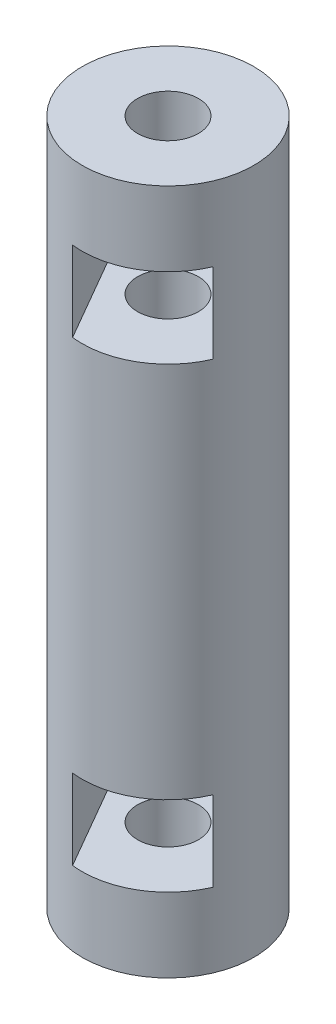
ISO-10303-21;
HEADER;
FILE_DESCRIPTION(('STEP AP214'),'2;1');
FILE_NAME('part.step','',(''),(''),'','','');
FILE_SCHEMA(('AUTOMOTIVE_DESIGN { 1 0 10303 214 1 1 1 1 }'));
ENDSEC;
DATA;
#1=APPLICATION_CONTEXT('core data for automotive mechanical design processes');
#2=APPLICATION_PROTOCOL_DEFINITION('international standard','automotive_design',2000,#1);
#3=PRODUCT_CONTEXT('',#1,'mechanical');
#4=PRODUCT('Part','Part','',(#3));
#5=PRODUCT_RELATED_PRODUCT_CATEGORY('part','',(#4));
#6=PRODUCT_DEFINITION_FORMATION('','',#4);
#7=PRODUCT_DEFINITION_CONTEXT('part definition',#1,'design');
#8=PRODUCT_DEFINITION('design','',#6,#7);
#9=PRODUCT_DEFINITION_SHAPE('','',#8);
#10=(LENGTH_UNIT() NAMED_UNIT(*) SI_UNIT(.MILLI.,.METRE.));
#11=(NAMED_UNIT(*) PLANE_ANGLE_UNIT() SI_UNIT($,.RADIAN.));
#12=(NAMED_UNIT(*) SI_UNIT($,.STERADIAN.) SOLID_ANGLE_UNIT());
#13=UNCERTAINTY_MEASURE_WITH_UNIT(LENGTH_MEASURE(1.E-05),#10,'distance_accuracy_value','');
#14=(GEOMETRIC_REPRESENTATION_CONTEXT(3) GLOBAL_UNCERTAINTY_ASSIGNED_CONTEXT((#13)) GLOBAL_UNIT_ASSIGNED_CONTEXT((#10,
#11,#12)) REPRESENTATION_CONTEXT('',''));
#15=CARTESIAN_POINT('',(0.,0.,0.));
#16=DIRECTION('',(0.,0.,1.));
#17=DIRECTION('',(1.,0.,0.));
#18=AXIS2_PLACEMENT_3D('',#15,#16,#17);
#19=CARTESIAN_POINT('',(0.,29.845,0.));
#20=DIRECTION('',(0.,1.,0.));
#21=DIRECTION('',(0.,0.,-1.));
#22=AXIS2_PLACEMENT_3D('',#19,#20,#21);
#23=PLANE('',#22);
#24=CARTESIAN_POINT('',(0.,29.845,0.));
#25=DIRECTION('',(0.,1.,0.));
#26=DIRECTION('',(0.,0.,1.));
#27=AXIS2_PLACEMENT_3D('',#24,#25,#26);
#28=CIRCLE('',#27,3.3782);
#29=CARTESIAN_POINT('',(0.,29.845,3.3782));
#30=VERTEX_POINT('',#29);
#31=EDGE_CURVE('E150',#30,#30,#28,.T.);
#32=ORIENTED_EDGE('',*,*,#31,.T.);
#33=EDGE_LOOP('',(#32));
#34=FACE_BOUND('',#33,.T.);
#35=DIRECTION('',(1.,0.,0.));
#36=VECTOR('',#35,1.);
#37=CARTESIAN_POINT('',(0.,29.845,-5.715));
#38=LINE('',#37,#36);
#39=CARTESIAN_POINT('',(-3.29955678841871,29.845,-5.715));
#40=VERTEX_POINT('',#39);
#41=CARTESIAN_POINT('',(3.29955678841871,29.845,-5.715));
#42=VERTEX_POINT('',#41);
#43=EDGE_CURVE('E59',#40,#42,#38,.T.);
#44=ORIENTED_EDGE('',*,*,#43,.T.);
#45=DIRECTION('',(0.5,0.,0.866025403784439));
#46=VECTOR('',#45,1.);
#47=CARTESIAN_POINT('',(4.94933518262807,29.845,-2.8575));
#48=LINE('',#47,#46);
#49=CARTESIAN_POINT('',(8.75933518262807,29.845,3.74161357683742));
#50=VERTEX_POINT('',#49);
#51=EDGE_CURVE('E222',#42,#50,#48,.T.);
#52=ORIENTED_EDGE('',*,*,#51,.T.);
#53=CARTESIAN_POINT('',(0.,29.845,0.));
#54=DIRECTION('',(0.,-1.,0.));
#55=DIRECTION('',(0.,0.,-1.));
#56=AXIS2_PLACEMENT_3D('',#53,#54,#55);
#57=CIRCLE('',#56,9.525);
#58=CARTESIAN_POINT('',(-1.13933518262807,29.845,9.45661357683742));
#59=VERTEX_POINT('',#58);
#60=EDGE_CURVE('E11',#59,#50,#57,.F.);
#61=ORIENTED_EDGE('',*,*,#60,.F.);
#62=DIRECTION('',(-0.5,0.,-0.866025403784439));
#63=VECTOR('',#62,1.);
#64=CARTESIAN_POINT('',(-4.94933518262807,29.845,2.8575));
#65=LINE('',#64,#63);
#66=CARTESIAN_POINT('',(-6.59911357683742,29.845,0.));
#67=VERTEX_POINT('',#66);
#68=EDGE_CURVE('E188',#59,#67,#65,.T.);
#69=ORIENTED_EDGE('',*,*,#68,.T.);
#70=DIRECTION('',(0.5,0.,-0.866025403784439));
#71=VECTOR('',#70,1.);
#72=CARTESIAN_POINT('',(-4.94933518262807,29.845,-2.8575));
#73=LINE('',#72,#71);
#74=EDGE_CURVE('E48',#67,#40,#73,.T.);
#75=ORIENTED_EDGE('',*,*,#74,.T.);
#76=EDGE_LOOP('',(#44,#52,#61,#69,#75));
#77=FACE_BOUND('',#76,.T.);
#78=ADVANCED_FACE('F39',(#34,#77),#23,.F.);
#79=CARTESIAN_POINT('',(-4.94933518262807,20.955,-2.8575));
#80=DIRECTION('',(-0.866025403784439,0.,-0.5));
#81=DIRECTION('',(-0.5,0.,0.866025403784439));
#82=AXIS2_PLACEMENT_3D('',#79,#80,#81);
#83=PLANE('',#82);
#84=ORIENTED_EDGE('',*,*,#74,.F.);
#85=DIRECTION('',(0.,1.,0.));
#86=VECTOR('',#85,1.);
#87=CARTESIAN_POINT('',(-6.59911357683742,20.955,0.));
#88=LINE('',#87,#86);
#89=CARTESIAN_POINT('',(-6.59911357683742,20.955,0.));
#90=VERTEX_POINT('',#89);
#91=EDGE_CURVE('E194',#90,#67,#88,.T.);
#92=ORIENTED_EDGE('',*,*,#91,.F.);
#93=DIRECTION('',(0.5,0.,-0.866025403784439));
#94=VECTOR('',#93,1.);
#95=CARTESIAN_POINT('',(-4.94933518262807,20.955,-2.8575));
#96=LINE('',#95,#94);
#97=CARTESIAN_POINT('',(-3.29955678841871,20.955,-5.715));
#98=VERTEX_POINT('',#97);
#99=EDGE_CURVE('E218',#90,#98,#96,.T.);
#100=ORIENTED_EDGE('',*,*,#99,.T.);
#101=DIRECTION('',(0.,1.,0.));
#102=VECTOR('',#101,1.);
#103=CARTESIAN_POINT('',(-3.29955678841871,20.955,-5.715));
#104=LINE('',#103,#102);
#105=EDGE_CURVE('E234',#98,#40,#104,.T.);
#106=ORIENTED_EDGE('',*,*,#105,.T.);
#107=EDGE_LOOP('',(#84,#92,#100,#106));
#108=FACE_BOUND('',#107,.T.);
#109=ADVANCED_FACE('F239',(#108),#83,.F.);
#110=CARTESIAN_POINT('',(0.,20.955,-5.715));
#111=DIRECTION('',(0.,0.,-1.));
#112=DIRECTION('',(-1.,0.,0.));
#113=AXIS2_PLACEMENT_3D('',#110,#111,#112);
#114=PLANE('',#113);
#115=ORIENTED_EDGE('',*,*,#43,.F.);
#116=ORIENTED_EDGE('',*,*,#105,.F.);
#117=DIRECTION('',(1.,0.,0.));
#118=VECTOR('',#117,1.);
#119=CARTESIAN_POINT('',(0.,20.955,-5.715));
#120=LINE('',#119,#118);
#121=CARTESIAN_POINT('',(3.29955678841871,20.955,-5.715));
#122=VERTEX_POINT('',#121);
#123=EDGE_CURVE('E206',#98,#122,#120,.T.);
#124=ORIENTED_EDGE('',*,*,#123,.T.);
#125=DIRECTION('',(0.,1.,0.));
#126=VECTOR('',#125,1.);
#127=CARTESIAN_POINT('',(3.29955678841871,20.955,-5.715));
#128=LINE('',#127,#126);
#129=EDGE_CURVE('E229',#122,#42,#128,.T.);
#130=ORIENTED_EDGE('',*,*,#129,.T.);
#131=EDGE_LOOP('',(#115,#116,#124,#130));
#132=FACE_BOUND('',#131,.T.);
#133=ADVANCED_FACE('F243',(#132),#114,.F.);
#134=CARTESIAN_POINT('',(4.94933518262807,20.955,-2.8575));
#135=DIRECTION('',(0.866025403784439,0.,-0.5));
#136=DIRECTION('',(-0.5,0.,-0.866025403784439));
#137=AXIS2_PLACEMENT_3D('',#134,#135,#136);
#138=PLANE('',#137);
#139=ORIENTED_EDGE('',*,*,#51,.F.);
#140=ORIENTED_EDGE('',*,*,#129,.F.);
#141=DIRECTION('',(0.5,0.,0.866025403784439));
#142=VECTOR('',#141,1.);
#143=CARTESIAN_POINT('',(4.94933518262807,20.955,-2.8575));
#144=LINE('',#143,#142);
#145=CARTESIAN_POINT('',(8.75933518262807,20.955,3.74161357683742));
#146=VERTEX_POINT('',#145);
#147=EDGE_CURVE('E210',#122,#146,#144,.T.);
#148=ORIENTED_EDGE('',*,*,#147,.T.);
#149=DIRECTION('',(0.,1.,0.));
#150=VECTOR('',#149,1.);
#151=CARTESIAN_POINT('',(8.75933518262807,20.955,3.74161357683742));
#152=LINE('',#151,#150);
#153=EDGE_CURVE('E225',#146,#50,#152,.T.);
#154=ORIENTED_EDGE('',*,*,#153,.T.);
#155=EDGE_LOOP('',(#139,#140,#148,#154));
#156=FACE_BOUND('',#155,.T.);
#157=ADVANCED_FACE('F247',(#156),#138,.F.);
#158=CARTESIAN_POINT('',(0.,20.955,0.));
#159=DIRECTION('',(0.,1.,0.));
#160=DIRECTION('',(0.,0.,-1.));
#161=AXIS2_PLACEMENT_3D('',#158,#159,#160);
#162=PLANE('',#161);
#163=CARTESIAN_POINT('',(0.,20.955,0.));
#164=DIRECTION('',(0.,1.,0.));
#165=DIRECTION('',(0.,0.,1.));
#166=AXIS2_PLACEMENT_3D('',#163,#164,#165);
#167=CIRCLE('',#166,3.3782);
#168=CARTESIAN_POINT('',(0.,20.955,3.3782));
#169=VERTEX_POINT('',#168);
#170=EDGE_CURVE('E277',#169,#169,#167,.T.);
#171=ORIENTED_EDGE('',*,*,#170,.F.);
#172=EDGE_LOOP('',(#171));
#173=FACE_BOUND('',#172,.T.);
#174=ORIENTED_EDGE('',*,*,#123,.F.);
#175=ORIENTED_EDGE('',*,*,#99,.F.);
#176=DIRECTION('',(-0.5,0.,-0.866025403784439));
#177=VECTOR('',#176,1.);
#178=CARTESIAN_POINT('',(-4.94933518262807,20.955,2.8575));
#179=LINE('',#178,#177);
#180=CARTESIAN_POINT('',(-1.13933518262807,20.955,9.45661357683742));
#181=VERTEX_POINT('',#180);
#182=EDGE_CURVE('E198',#181,#90,#179,.T.);
#183=ORIENTED_EDGE('',*,*,#182,.F.);
#184=CARTESIAN_POINT('',(0.,20.955,0.));
#185=DIRECTION('',(0.,-1.,0.));
#186=DIRECTION('',(0.,0.,-1.));
#187=AXIS2_PLACEMENT_3D('',#184,#185,#186);
#188=CIRCLE('',#187,9.525);
#189=EDGE_CURVE('E214',#181,#146,#188,.F.);
#190=ORIENTED_EDGE('',*,*,#189,.T.);
#191=ORIENTED_EDGE('',*,*,#147,.F.);
#192=EDGE_LOOP('',(#174,#175,#183,#190,#191));
#193=FACE_BOUND('',#192,.T.);
#194=ADVANCED_FACE('F257',(#173,#193),#162,.T.);
#195=CARTESIAN_POINT('',(-4.94933518262807,20.955,2.8575));
#196=DIRECTION('',(-0.866025403784439,0.,0.5));
#197=DIRECTION('',(0.5,0.,0.866025403784439));
#198=AXIS2_PLACEMENT_3D('',#195,#196,#197);
#199=PLANE('',#198);
#200=ORIENTED_EDGE('',*,*,#68,.F.);
#201=DIRECTION('',(0.,1.,0.));
#202=VECTOR('',#201,1.);
#203=CARTESIAN_POINT('',(-1.13933518262807,20.955,9.45661357683742));
#204=LINE('',#203,#202);
#205=EDGE_CURVE('E202',#181,#59,#204,.T.);
#206=ORIENTED_EDGE('',*,*,#205,.F.);
#207=ORIENTED_EDGE('',*,*,#182,.T.);
#208=ORIENTED_EDGE('',*,*,#91,.T.);
#209=EDGE_LOOP('',(#200,#206,#207,#208));
#210=FACE_BOUND('',#209,.T.);
#211=ADVANCED_FACE('F255',(#210),#199,.F.);
#212=CARTESIAN_POINT('',(0.,38.1,0.));
#213=DIRECTION('',(0.,-1.,0.));
#214=DIRECTION('',(0.,0.,-1.));
#215=AXIS2_PLACEMENT_3D('',#212,#213,#214);
#216=CYLINDRICAL_SURFACE('',#215,9.525);
#217=ORIENTED_EDGE('',*,*,#189,.F.);
#218=ORIENTED_EDGE('',*,*,#205,.T.);
#219=ORIENTED_EDGE('',*,*,#60,.T.);
#220=ORIENTED_EDGE('',*,*,#153,.F.);
#221=EDGE_LOOP('',(#217,#218,#219,#220));
#222=FACE_BOUND('',#221,.T.);
#223=CARTESIAN_POINT('',(0.,-38.1,0.));
#224=DIRECTION('',(0.,1.,0.));
#225=DIRECTION('',(0.,0.,1.));
#226=AXIS2_PLACEMENT_3D('',#223,#224,#225);
#227=CIRCLE('',#226,9.525);
#228=CARTESIAN_POINT('',(0.,-38.1,9.525));
#229=VERTEX_POINT('',#228);
#230=EDGE_CURVE('E174',#229,#229,#227,.T.);
#231=ORIENTED_EDGE('',*,*,#230,.T.);
#232=EDGE_LOOP('',(#231));
#233=FACE_BOUND('',#232,.T.);
#234=CARTESIAN_POINT('',(0.,38.1,0.));
#235=DIRECTION('',(0.,1.,0.));
#236=DIRECTION('',(0.,0.,1.));
#237=AXIS2_PLACEMENT_3D('',#234,#235,#236);
#238=CIRCLE('',#237,9.525);
#239=CARTESIAN_POINT('',(0.,38.1,9.525));
#240=VERTEX_POINT('',#239);
#241=EDGE_CURVE('E184',#240,#240,#238,.T.);
#242=ORIENTED_EDGE('',*,*,#241,.F.);
#243=EDGE_LOOP('',(#242));
#244=FACE_BOUND('',#243,.T.);
#245=CARTESIAN_POINT('',(0.,-20.955,0.));
#246=DIRECTION('',(0.,-1.,0.));
#247=DIRECTION('',(0.,0.,-1.));
#248=AXIS2_PLACEMENT_3D('',#245,#246,#247);
#249=CIRCLE('',#248,9.525);
#250=CARTESIAN_POINT('',(-1.13933518262807,-20.955,9.45661357683742));
#251=VERTEX_POINT('',#250);
#252=CARTESIAN_POINT('',(8.75933518262807,-20.955,3.74161357683742));
#253=VERTEX_POINT('',#252);
#254=EDGE_CURVE('E137',#251,#253,#249,.F.);
#255=ORIENTED_EDGE('',*,*,#254,.T.);
#256=DIRECTION('',(0.,-1.,0.));
#257=VECTOR('',#256,1.);
#258=CARTESIAN_POINT('',(8.75933518262807,-20.955,3.74161357683742));
#259=LINE('',#258,#257);
#260=CARTESIAN_POINT('',(8.75933518262807,-29.845,3.74161357683742));
#261=VERTEX_POINT('',#260);
#262=EDGE_CURVE('E127',#253,#261,#259,.T.);
#263=ORIENTED_EDGE('',*,*,#262,.T.);
#264=CARTESIAN_POINT('',(0.,-29.845,0.));
#265=DIRECTION('',(0.,-1.,0.));
#266=DIRECTION('',(0.,0.,-1.));
#267=AXIS2_PLACEMENT_3D('',#264,#265,#266);
#268=CIRCLE('',#267,9.525);
#269=CARTESIAN_POINT('',(-1.13933518262807,-29.845,9.45661357683742));
#270=VERTEX_POINT('',#269);
#271=EDGE_CURVE('E165',#270,#261,#268,.F.);
#272=ORIENTED_EDGE('',*,*,#271,.F.);
#273=DIRECTION('',(0.,-1.,0.));
#274=VECTOR('',#273,1.);
#275=CARTESIAN_POINT('',(-1.13933518262807,-20.955,9.45661357683742));
#276=LINE('',#275,#274);
#277=EDGE_CURVE('E178',#251,#270,#276,.T.);
#278=ORIENTED_EDGE('',*,*,#277,.F.);
#279=EDGE_LOOP('',(#255,#263,#272,#278));
#280=FACE_BOUND('',#279,.T.);
#281=ADVANCED_FACE('F251',(#222,#233,#244,#280),#216,.T.);
#282=CARTESIAN_POINT('',(0.,38.1,0.));
#283=DIRECTION('',(0.,1.,0.));
#284=DIRECTION('',(0.,0.,1.));
#285=AXIS2_PLACEMENT_3D('',#282,#283,#284);
#286=PLANE('',#285);
#287=CARTESIAN_POINT('',(0.,38.1,0.));
#288=DIRECTION('',(0.,1.,0.));
#289=DIRECTION('',(0.,0.,1.));
#290=AXIS2_PLACEMENT_3D('',#287,#288,#289);
#291=CIRCLE('',#290,3.3782);
#292=CARTESIAN_POINT('',(0.,38.1,3.3782));
#293=VERTEX_POINT('',#292);
#294=EDGE_CURVE('E286',#293,#293,#291,.T.);
#295=ORIENTED_EDGE('',*,*,#294,.F.);
#296=EDGE_LOOP('',(#295));
#297=FACE_BOUND('',#296,.T.);
#298=ORIENTED_EDGE('',*,*,#241,.T.);
#299=EDGE_LOOP('',(#298));
#300=FACE_BOUND('',#299,.T.);
#301=ADVANCED_FACE('F320',(#297,#300),#286,.T.);
#302=CARTESIAN_POINT('',(0.,-38.1,0.));
#303=DIRECTION('',(0.,1.,0.));
#304=DIRECTION('',(0.,0.,1.));
#305=AXIS2_PLACEMENT_3D('',#302,#303,#304);
#306=PLANE('',#305);
#307=CARTESIAN_POINT('',(0.,-38.1,0.));
#308=DIRECTION('',(0.,1.,0.));
#309=DIRECTION('',(0.,0.,1.));
#310=AXIS2_PLACEMENT_3D('',#307,#308,#309);
#311=CIRCLE('',#310,3.3782);
#312=CARTESIAN_POINT('',(0.,-38.1,3.3782));
#313=VERTEX_POINT('',#312);
#314=EDGE_CURVE('E290',#313,#313,#311,.T.);
#315=ORIENTED_EDGE('',*,*,#314,.T.);
#316=EDGE_LOOP('',(#315));
#317=FACE_BOUND('',#316,.T.);
#318=ORIENTED_EDGE('',*,*,#230,.F.);
#319=EDGE_LOOP('',(#318));
#320=FACE_BOUND('',#319,.T.);
#321=ADVANCED_FACE('F323',(#317,#320),#306,.F.);
#322=CARTESIAN_POINT('',(0.,-20.955,-5.715));
#323=DIRECTION('',(0.,0.,-1.));
#324=DIRECTION('',(-1.,0.,0.));
#325=AXIS2_PLACEMENT_3D('',#322,#323,#324);
#326=PLANE('',#325);
#327=DIRECTION('',(1.,0.,0.));
#328=VECTOR('',#327,1.);
#329=CARTESIAN_POINT('',(0.,-29.845,-5.715));
#330=LINE('',#329,#328);
#331=CARTESIAN_POINT('',(-3.29955678841871,-29.845,-5.715));
#332=VERTEX_POINT('',#331);
#333=CARTESIAN_POINT('',(3.29955678841871,-29.845,-5.715));
#334=VERTEX_POINT('',#333);
#335=EDGE_CURVE('E122',#332,#334,#330,.T.);
#336=ORIENTED_EDGE('',*,*,#335,.T.);
#337=DIRECTION('',(0.,-1.,0.));
#338=VECTOR('',#337,1.);
#339=CARTESIAN_POINT('',(3.29955678841871,-20.955,-5.715));
#340=LINE('',#339,#338);
#341=CARTESIAN_POINT('',(3.29955678841871,-20.955,-5.715));
#342=VERTEX_POINT('',#341);
#343=EDGE_CURVE('E115',#342,#334,#340,.T.);
#344=ORIENTED_EDGE('',*,*,#343,.F.);
#345=DIRECTION('',(1.,0.,0.));
#346=VECTOR('',#345,1.);
#347=CARTESIAN_POINT('',(0.,-20.955,-5.715));
#348=LINE('',#347,#346);
#349=CARTESIAN_POINT('',(-3.29955678841871,-20.955,-5.715));
#350=VERTEX_POINT('',#349);
#351=EDGE_CURVE('E119',#350,#342,#348,.T.);
#352=ORIENTED_EDGE('',*,*,#351,.F.);
#353=DIRECTION('',(0.,-1.,0.));
#354=VECTOR('',#353,1.);
#355=CARTESIAN_POINT('',(-3.29955678841871,-20.955,-5.715));
#356=LINE('',#355,#354);
#357=EDGE_CURVE('E171',#350,#332,#356,.T.);
#358=ORIENTED_EDGE('',*,*,#357,.T.);
#359=EDGE_LOOP('',(#336,#344,#352,#358));
#360=FACE_BOUND('',#359,.T.);
#361=ADVANCED_FACE('F117',(#360),#326,.F.);
#362=CARTESIAN_POINT('',(-4.94933518262807,-20.955,-2.8575));
#363=DIRECTION('',(-0.866025403784439,0.,-0.5));
#364=DIRECTION('',(-0.5,0.,0.866025403784439));
#365=AXIS2_PLACEMENT_3D('',#362,#363,#364);
#366=PLANE('',#365);
#367=DIRECTION('',(0.5,0.,-0.866025403784439));
#368=VECTOR('',#367,1.);
#369=CARTESIAN_POINT('',(-4.94933518262807,-29.845,-2.8575));
#370=LINE('',#369,#368);
#371=CARTESIAN_POINT('',(-6.59911357683742,-29.845,0.));
#372=VERTEX_POINT('',#371);
#373=EDGE_CURVE('E143',#372,#332,#370,.T.);
#374=ORIENTED_EDGE('',*,*,#373,.T.);
#375=ORIENTED_EDGE('',*,*,#357,.F.);
#376=DIRECTION('',(0.5,0.,-0.866025403784439));
#377=VECTOR('',#376,1.);
#378=CARTESIAN_POINT('',(-4.94933518262807,-20.955,-2.8575));
#379=LINE('',#378,#377);
#380=CARTESIAN_POINT('',(-6.59911357683742,-20.955,0.));
#381=VERTEX_POINT('',#380);
#382=EDGE_CURVE('E128',#381,#350,#379,.T.);
#383=ORIENTED_EDGE('',*,*,#382,.F.);
#384=DIRECTION('',(0.,-1.,0.));
#385=VECTOR('',#384,1.);
#386=CARTESIAN_POINT('',(-6.59911357683742,-20.955,0.));
#387=LINE('',#386,#385);
#388=EDGE_CURVE('E175',#381,#372,#387,.T.);
#389=ORIENTED_EDGE('',*,*,#388,.T.);
#390=EDGE_LOOP('',(#374,#375,#383,#389));
#391=FACE_BOUND('',#390,.T.);
#392=ADVANCED_FACE('F337',(#391),#366,.F.);
#393=CARTESIAN_POINT('',(-4.94933518262807,-20.955,2.8575));
#394=DIRECTION('',(-0.866025403784439,0.,0.5));
#395=DIRECTION('',(0.5,0.,0.866025403784439));
#396=AXIS2_PLACEMENT_3D('',#393,#394,#395);
#397=PLANE('',#396);
#398=DIRECTION('',(-0.5,0.,-0.866025403784439));
#399=VECTOR('',#398,1.);
#400=CARTESIAN_POINT('',(-4.94933518262807,-29.845,2.8575));
#401=LINE('',#400,#399);
#402=EDGE_CURVE('E147',#270,#372,#401,.T.);
#403=ORIENTED_EDGE('',*,*,#402,.T.);
#404=ORIENTED_EDGE('',*,*,#388,.F.);
#405=DIRECTION('',(-0.5,0.,-0.866025403784439));
#406=VECTOR('',#405,1.);
#407=CARTESIAN_POINT('',(-4.94933518262807,-20.955,2.8575));
#408=LINE('',#407,#406);
#409=EDGE_CURVE('E155',#251,#381,#408,.T.);
#410=ORIENTED_EDGE('',*,*,#409,.F.);
#411=ORIENTED_EDGE('',*,*,#277,.T.);
#412=EDGE_LOOP('',(#403,#404,#410,#411));
#413=FACE_BOUND('',#412,.T.);
#414=ADVANCED_FACE('F334',(#413),#397,.F.);
#415=CARTESIAN_POINT('',(4.94933518262807,-20.955,-2.8575));
#416=DIRECTION('',(0.866025403784439,0.,-0.5));
#417=DIRECTION('',(-0.5,0.,-0.866025403784439));
#418=AXIS2_PLACEMENT_3D('',#415,#416,#417);
#419=PLANE('',#418);
#420=DIRECTION('',(0.5,0.,0.866025403784439));
#421=VECTOR('',#420,1.);
#422=CARTESIAN_POINT('',(4.94933518262807,-29.845,-2.8575));
#423=LINE('',#422,#421);
#424=EDGE_CURVE('E162',#334,#261,#423,.T.);
#425=ORIENTED_EDGE('',*,*,#424,.T.);
#426=ORIENTED_EDGE('',*,*,#262,.F.);
#427=DIRECTION('',(0.5,0.,0.866025403784439));
#428=VECTOR('',#427,1.);
#429=CARTESIAN_POINT('',(4.94933518262807,-20.955,-2.8575));
#430=LINE('',#429,#428);
#431=EDGE_CURVE('E131',#342,#253,#430,.T.);
#432=ORIENTED_EDGE('',*,*,#431,.F.);
#433=ORIENTED_EDGE('',*,*,#343,.T.);
#434=EDGE_LOOP('',(#425,#426,#432,#433));
#435=FACE_BOUND('',#434,.T.);
#436=ADVANCED_FACE('F132',(#435),#419,.F.);
#437=CARTESIAN_POINT('',(0.,-20.955,0.));
#438=DIRECTION('',(0.,-1.,0.));
#439=DIRECTION('',(0.,0.,-1.));
#440=AXIS2_PLACEMENT_3D('',#437,#438,#439);
#441=PLANE('',#440);
#442=CARTESIAN_POINT('',(0.,-20.955,0.));
#443=DIRECTION('',(0.,-1.,0.));
#444=DIRECTION('',(0.,0.,-1.));
#445=AXIS2_PLACEMENT_3D('',#442,#443,#444);
#446=CIRCLE('',#445,3.3782);
#447=CARTESIAN_POINT('',(0.,-20.955,3.3782));
#448=VERTEX_POINT('',#447);
#449=EDGE_CURVE('E280',#448,#448,#446,.T.);
#450=ORIENTED_EDGE('',*,*,#449,.F.);
#451=EDGE_LOOP('',(#450));
#452=FACE_BOUND('',#451,.T.);
#453=ORIENTED_EDGE('',*,*,#351,.T.);
#454=ORIENTED_EDGE('',*,*,#431,.T.);
#455=ORIENTED_EDGE('',*,*,#254,.F.);
#456=ORIENTED_EDGE('',*,*,#409,.T.);
#457=ORIENTED_EDGE('',*,*,#382,.T.);
#458=EDGE_LOOP('',(#453,#454,#455,#456,#457));
#459=FACE_BOUND('',#458,.T.);
#460=ADVANCED_FACE('F139',(#452,#459),#441,.T.);
#461=CARTESIAN_POINT('',(0.,-29.845,0.));
#462=DIRECTION('',(0.,-1.,0.));
#463=DIRECTION('',(0.,0.,-1.));
#464=AXIS2_PLACEMENT_3D('',#461,#462,#463);
#465=PLANE('',#464);
#466=CARTESIAN_POINT('',(0.,-29.845,0.));
#467=DIRECTION('',(0.,-1.,0.));
#468=DIRECTION('',(0.,0.,-1.));
#469=AXIS2_PLACEMENT_3D('',#466,#467,#468);
#470=CIRCLE('',#469,3.3782);
#471=CARTESIAN_POINT('',(0.,-29.845,3.3782));
#472=VERTEX_POINT('',#471);
#473=EDGE_CURVE('E42',#472,#472,#470,.T.);
#474=ORIENTED_EDGE('',*,*,#473,.T.);
#475=EDGE_LOOP('',(#474));
#476=FACE_BOUND('',#475,.T.);
#477=ORIENTED_EDGE('',*,*,#335,.F.);
#478=ORIENTED_EDGE('',*,*,#373,.F.);
#479=ORIENTED_EDGE('',*,*,#402,.F.);
#480=ORIENTED_EDGE('',*,*,#271,.T.);
#481=ORIENTED_EDGE('',*,*,#424,.F.);
#482=EDGE_LOOP('',(#477,#478,#479,#480,#481));
#483=FACE_BOUND('',#482,.T.);
#484=ADVANCED_FACE('F299',(#476,#483),#465,.F.);
#485=CARTESIAN_POINT('',(0.,-38.1,0.));
#486=DIRECTION('',(0.,1.,0.));
#487=DIRECTION('',(0.,0.,1.));
#488=AXIS2_PLACEMENT_3D('',#485,#486,#487);
#489=CYLINDRICAL_SURFACE('',#488,3.3782);
#490=CARTESIAN_POINT('',(0.,-38.1,3.3782));
#491=CARTESIAN_POINT('',(0.,-38.0140104166667,3.3782));
#492=CARTESIAN_POINT('',(0.,-37.9280208333333,3.3782));
#493=CARTESIAN_POINT('',(0.,-37.7560416666667,3.3782));
#494=CARTESIAN_POINT('',(0.,-37.6700520833333,3.3782));
#495=CARTESIAN_POINT('',(0.,-37.4980729166667,3.3782));
#496=CARTESIAN_POINT('',(0.,-37.4120833333333,3.3782));
#497=CARTESIAN_POINT('',(0.,-37.2401041666667,3.3782));
#498=CARTESIAN_POINT('',(0.,-37.1541145833333,3.3782));
#499=CARTESIAN_POINT('',(0.,-36.9821354166667,3.3782));
#500=CARTESIAN_POINT('',(0.,-36.8961458333333,3.3782));
#501=CARTESIAN_POINT('',(0.,-36.7241666666667,3.3782));
#502=CARTESIAN_POINT('',(0.,-36.6381770833333,3.3782));
#503=CARTESIAN_POINT('',(0.,-36.4661979166667,3.3782));
#504=CARTESIAN_POINT('',(0.,-36.3802083333333,3.3782));
#505=CARTESIAN_POINT('',(0.,-36.2082291666667,3.3782));
#506=CARTESIAN_POINT('',(0.,-36.1222395833333,3.3782));
#507=CARTESIAN_POINT('',(0.,-35.9502604166667,3.3782));
#508=CARTESIAN_POINT('',(0.,-35.8642708333333,3.3782));
#509=CARTESIAN_POINT('',(0.,-35.6922916666667,3.3782));
#510=CARTESIAN_POINT('',(0.,-35.6063020833333,3.3782));
#511=CARTESIAN_POINT('',(0.,-35.4343229166667,3.3782));
#512=CARTESIAN_POINT('',(0.,-35.3483333333333,3.3782));
#513=CARTESIAN_POINT('',(0.,-35.1763541666667,3.3782));
#514=CARTESIAN_POINT('',(0.,-35.0903645833333,3.3782));
#515=CARTESIAN_POINT('',(0.,-34.9183854166667,3.3782));
#516=CARTESIAN_POINT('',(0.,-34.8323958333333,3.3782));
#517=CARTESIAN_POINT('',(0.,-34.6604166666667,3.3782));
#518=CARTESIAN_POINT('',(0.,-34.5744270833333,3.3782));
#519=CARTESIAN_POINT('',(0.,-34.4024479166667,3.3782));
#520=CARTESIAN_POINT('',(0.,-34.3164583333333,3.3782));
#521=CARTESIAN_POINT('',(0.,-34.1444791666667,3.3782));
#522=CARTESIAN_POINT('',(0.,-34.0584895833333,3.3782));
#523=CARTESIAN_POINT('',(0.,-33.8865104166667,3.3782));
#524=CARTESIAN_POINT('',(0.,-33.8005208333333,3.3782));
#525=CARTESIAN_POINT('',(0.,-33.6285416666667,3.3782));
#526=CARTESIAN_POINT('',(0.,-33.5425520833333,3.3782));
#527=CARTESIAN_POINT('',(0.,-33.3705729166667,3.3782));
#528=CARTESIAN_POINT('',(0.,-33.2845833333333,3.3782));
#529=CARTESIAN_POINT('',(0.,-33.1126041666667,3.3782));
#530=CARTESIAN_POINT('',(0.,-33.0266145833333,3.3782));
#531=CARTESIAN_POINT('',(0.,-32.8546354166667,3.3782));
#532=CARTESIAN_POINT('',(0.,-32.7686458333333,3.3782));
#533=CARTESIAN_POINT('',(0.,-32.5966666666667,3.3782));
#534=CARTESIAN_POINT('',(0.,-32.5106770833333,3.3782));
#535=CARTESIAN_POINT('',(0.,-32.3386979166667,3.3782));
#536=CARTESIAN_POINT('',(0.,-32.2527083333333,3.3782));
#537=CARTESIAN_POINT('',(0.,-32.0807291666667,3.3782));
#538=CARTESIAN_POINT('',(0.,-31.9947395833333,3.3782));
#539=CARTESIAN_POINT('',(0.,-31.8227604166667,3.3782));
#540=CARTESIAN_POINT('',(0.,-31.7367708333333,3.3782));
#541=CARTESIAN_POINT('',(0.,-31.5647916666667,3.3782));
#542=CARTESIAN_POINT('',(0.,-31.4788020833333,3.3782));
#543=CARTESIAN_POINT('',(0.,-31.3068229166667,3.3782));
#544=CARTESIAN_POINT('',(0.,-31.2208333333333,3.3782));
#545=CARTESIAN_POINT('',(0.,-31.0488541666667,3.3782));
#546=CARTESIAN_POINT('',(0.,-30.9628645833333,3.3782));
#547=CARTESIAN_POINT('',(0.,-30.7908854166667,3.3782));
#548=CARTESIAN_POINT('',(0.,-30.7048958333333,3.3782));
#549=CARTESIAN_POINT('',(0.,-30.5329166666667,3.3782));
#550=CARTESIAN_POINT('',(0.,-30.4469270833333,3.3782));
#551=CARTESIAN_POINT('',(0.,-30.2749479166667,3.3782));
#552=CARTESIAN_POINT('',(0.,-30.1889583333333,3.3782));
#553=CARTESIAN_POINT('',(0.,-30.0169791666667,3.3782));
#554=CARTESIAN_POINT('',(0.,-29.9309895833333,3.3782));
#555=CARTESIAN_POINT('',(0.,-29.845,3.3782));
#556=B_SPLINE_CURVE_WITH_KNOTS('',3,(#490,#491,#492,#493,#494,#495,#496,#497,#498,#499,#500,
#501,#502,#503,#504,#505,#506,#507,#508,#509,#510,#511,#512,#513,#514,#515,#516,#517,#518,#519,
#520,#521,#522,#523,#524,#525,#526,#527,#528,#529,#530,#531,#532,#533,#534,#535,#536,#537,#538,
#539,#540,#541,#542,#543,#544,#545,#546,#547,#548,#549,#550,#551,#552,#553,#554,#555),
.UNSPECIFIED.,.F.,.F.,(4,2,2,2,2,2,2,2,2,2,2,2,2,2,2,2,2,2,2,2,2,2,2,2,2,2,2,2,2,2,2,2,4),(0.,
0.257968750000004,0.515937500000001,0.773906250000005,1.031875,1.28984375000001,1.5478125,
1.80578125000001,2.06375,2.32171875000001,2.5796875,2.83765625000001,3.095625,3.35359375000001,
3.61156250000001,3.86953125,4.12750000000001,4.38546875,4.64343750000001,4.90140625,
5.15937500000001,5.41734375000001,5.67531250000001,5.93328125000001,6.19125000000001,
6.44921875000001,6.70718750000001,6.96515625000001,7.22312500000001,7.48109375000001,
7.73906250000001,7.99703125000001,8.25500000000001),.UNSPECIFIED.);
#557=EDGE_CURVE('BSEAM302',#313,#472,#556,.T.);
#558=ORIENTED_EDGE('',*,*,#314,.F.);
#559=ORIENTED_EDGE('',*,*,#473,.F.);
#560=ORIENTED_EDGE('',*,*,#557,.T.);
#561=ORIENTED_EDGE('',*,*,#557,.F.);
#562=EDGE_LOOP('',(#558,#560,#559,#561));
#563=FACE_BOUND('',#562,.T.);
#564=ADVANCED_FACE('F302',(#563),#489,.F.);
#565=CARTESIAN_POINT('',(0.,20.955,3.3782));
#566=CARTESIAN_POINT('',(0.,20.5184375,3.3782));
#567=CARTESIAN_POINT('',(0.,20.081875,3.3782));
#568=CARTESIAN_POINT('',(0.,19.20875,3.3782));
#569=CARTESIAN_POINT('',(0.,18.7721875,3.3782));
#570=CARTESIAN_POINT('',(0.,17.8990625,3.3782));
#571=CARTESIAN_POINT('',(0.,17.4625,3.3782));
#572=CARTESIAN_POINT('',(0.,16.589375,3.3782));
#573=CARTESIAN_POINT('',(0.,16.1528125,3.3782));
#574=CARTESIAN_POINT('',(0.,15.2796875,3.3782));
#575=CARTESIAN_POINT('',(0.,14.843125,3.3782));
#576=CARTESIAN_POINT('',(0.,13.97,3.3782));
#577=CARTESIAN_POINT('',(0.,13.5334375,3.3782));
#578=CARTESIAN_POINT('',(0.,12.6603125,3.3782));
#579=CARTESIAN_POINT('',(0.,12.22375,3.3782));
#580=CARTESIAN_POINT('',(0.,11.350625,3.3782));
#581=CARTESIAN_POINT('',(0.,10.9140625,3.3782));
#582=CARTESIAN_POINT('',(0.,10.0409375,3.3782));
#583=CARTESIAN_POINT('',(0.,9.604375,3.3782));
#584=CARTESIAN_POINT('',(0.,8.73125,3.3782));
#585=CARTESIAN_POINT('',(0.,8.2946875,3.3782));
#586=CARTESIAN_POINT('',(0.,7.4215625,3.3782));
#587=CARTESIAN_POINT('',(0.,6.985,3.3782));
#588=CARTESIAN_POINT('',(0.,6.111875,3.3782));
#589=CARTESIAN_POINT('',(0.,5.6753125,3.3782));
#590=CARTESIAN_POINT('',(0.,4.8021875,3.3782));
#591=CARTESIAN_POINT('',(0.,4.365625,3.3782));
#592=CARTESIAN_POINT('',(0.,3.4925,3.3782));
#593=CARTESIAN_POINT('',(0.,3.05593749999999,3.3782));
#594=CARTESIAN_POINT('',(0.,2.18281249999999,3.3782));
#595=CARTESIAN_POINT('',(0.,1.74625,3.3782));
#596=CARTESIAN_POINT('',(0.,0.873124999999998,3.3782));
#597=CARTESIAN_POINT('',(0.,0.436562499999999,3.3782));
#598=CARTESIAN_POINT('',(0.,-0.436562500000001,3.3782));
#599=CARTESIAN_POINT('',(0.,-0.873125000000002,3.3782));
#600=CARTESIAN_POINT('',(0.,-1.74625,3.3782));
#601=CARTESIAN_POINT('',(0.,-2.18281250000001,3.3782));
#602=CARTESIAN_POINT('',(0.,-3.05593750000001,3.3782));
#603=CARTESIAN_POINT('',(0.,-3.4925,3.3782));
#604=CARTESIAN_POINT('',(0.,-4.365625,3.3782));
#605=CARTESIAN_POINT('',(0.,-4.8021875,3.3782));
#606=CARTESIAN_POINT('',(0.,-5.6753125,3.3782));
#607=CARTESIAN_POINT('',(0.,-6.111875,3.3782));
#608=CARTESIAN_POINT('',(0.,-6.985,3.3782));
#609=CARTESIAN_POINT('',(0.,-7.4215625,3.3782));
#610=CARTESIAN_POINT('',(0.,-8.2946875,3.3782));
#611=CARTESIAN_POINT('',(0.,-8.73125,3.3782));
#612=CARTESIAN_POINT('',(0.,-9.604375,3.3782));
#613=CARTESIAN_POINT('',(0.,-10.0409375,3.3782));
#614=CARTESIAN_POINT('',(0.,-10.9140625,3.3782));
#615=CARTESIAN_POINT('',(0.,-11.350625,3.3782));
#616=CARTESIAN_POINT('',(0.,-12.22375,3.3782));
#617=CARTESIAN_POINT('',(0.,-12.6603125,3.3782));
#618=CARTESIAN_POINT('',(0.,-13.5334375,3.3782));
#619=CARTESIAN_POINT('',(0.,-13.97,3.3782));
#620=CARTESIAN_POINT('',(0.,-14.843125,3.3782));
#621=CARTESIAN_POINT('',(0.,-15.2796875,3.3782));
#622=CARTESIAN_POINT('',(0.,-16.1528125,3.3782));
#623=CARTESIAN_POINT('',(0.,-16.589375,3.3782));
#624=CARTESIAN_POINT('',(0.,-17.4625,3.3782));
#625=CARTESIAN_POINT('',(0.,-17.8990625,3.3782));
#626=CARTESIAN_POINT('',(0.,-18.7721875,3.3782));
#627=CARTESIAN_POINT('',(0.,-19.20875,3.3782));
#628=CARTESIAN_POINT('',(0.,-20.081875,3.3782));
#629=CARTESIAN_POINT('',(0.,-20.5184375,3.3782));
#630=CARTESIAN_POINT('',(0.,-20.955,3.3782));
#631=B_SPLINE_CURVE_WITH_KNOTS('',3,(#565,#566,#567,#568,#569,#570,#571,#572,#573,#574,#575,
#576,#577,#578,#579,#580,#581,#582,#583,#584,#585,#586,#587,#588,#589,#590,#591,#592,#593,#594,
#595,#596,#597,#598,#599,#600,#601,#602,#603,#604,#605,#606,#607,#608,#609,#610,#611,#612,#613,
#614,#615,#616,#617,#618,#619,#620,#621,#622,#623,#624,#625,#626,#627,#628,#629,#630),
.UNSPECIFIED.,.F.,.F.,(4,2,2,2,2,2,2,2,2,2,2,2,2,2,2,2,2,2,2,2,2,2,2,2,2,2,2,2,2,2,2,2,4),(0.,
1.3096875,2.619375,3.9290625,5.23875,6.5484375,7.858125,9.1678125,10.4775,11.7871875,13.096875,
14.4065625,15.71625,17.0259375,18.335625,19.6453125,20.955,22.2646875,23.574375,24.8840625,
26.19375,27.5034375,28.813125,30.1228125,31.4325,32.7421875,34.051875,35.3615625,36.67125,
37.9809375,39.290625,40.6003125,41.91),.UNSPECIFIED.);
#632=EDGE_CURVE('BSEAM304',#169,#448,#631,.T.);
#633=ORIENTED_EDGE('',*,*,#170,.T.);
#634=ORIENTED_EDGE('',*,*,#449,.T.);
#635=ORIENTED_EDGE('',*,*,#632,.T.);
#636=ORIENTED_EDGE('',*,*,#632,.F.);
#637=EDGE_LOOP('',(#633,#635,#634,#636));
#638=FACE_BOUND('',#637,.T.);
#639=ADVANCED_FACE('F304',(#638),#489,.F.);
#640=CARTESIAN_POINT('',(0.,38.1,3.3782));
#641=CARTESIAN_POINT('',(0.,38.0140104166667,3.3782));
#642=CARTESIAN_POINT('',(0.,37.9280208333333,3.3782));
#643=CARTESIAN_POINT('',(0.,37.7560416666667,3.3782));
#644=CARTESIAN_POINT('',(0.,37.6700520833333,3.3782));
#645=CARTESIAN_POINT('',(0.,37.4980729166667,3.3782));
#646=CARTESIAN_POINT('',(0.,37.4120833333333,3.3782));
#647=CARTESIAN_POINT('',(0.,37.2401041666667,3.3782));
#648=CARTESIAN_POINT('',(0.,37.1541145833333,3.3782));
#649=CARTESIAN_POINT('',(0.,36.9821354166667,3.3782));
#650=CARTESIAN_POINT('',(0.,36.8961458333333,3.3782));
#651=CARTESIAN_POINT('',(0.,36.7241666666667,3.3782));
#652=CARTESIAN_POINT('',(0.,36.6381770833333,3.3782));
#653=CARTESIAN_POINT('',(0.,36.4661979166667,3.3782));
#654=CARTESIAN_POINT('',(0.,36.3802083333333,3.3782));
#655=CARTESIAN_POINT('',(0.,36.2082291666667,3.3782));
#656=CARTESIAN_POINT('',(0.,36.1222395833333,3.3782));
#657=CARTESIAN_POINT('',(0.,35.9502604166667,3.3782));
#658=CARTESIAN_POINT('',(0.,35.8642708333333,3.3782));
#659=CARTESIAN_POINT('',(0.,35.6922916666667,3.3782));
#660=CARTESIAN_POINT('',(0.,35.6063020833333,3.3782));
#661=CARTESIAN_POINT('',(0.,35.4343229166667,3.3782));
#662=CARTESIAN_POINT('',(0.,35.3483333333333,3.3782));
#663=CARTESIAN_POINT('',(0.,35.1763541666667,3.3782));
#664=CARTESIAN_POINT('',(0.,35.0903645833333,3.3782));
#665=CARTESIAN_POINT('',(0.,34.9183854166667,3.3782));
#666=CARTESIAN_POINT('',(0.,34.8323958333333,3.3782));
#667=CARTESIAN_POINT('',(0.,34.6604166666667,3.3782));
#668=CARTESIAN_POINT('',(0.,34.5744270833333,3.3782));
#669=CARTESIAN_POINT('',(0.,34.4024479166667,3.3782));
#670=CARTESIAN_POINT('',(0.,34.3164583333333,3.3782));
#671=CARTESIAN_POINT('',(0.,34.1444791666667,3.3782));
#672=CARTESIAN_POINT('',(0.,34.0584895833333,3.3782));
#673=CARTESIAN_POINT('',(0.,33.8865104166667,3.3782));
#674=CARTESIAN_POINT('',(0.,33.8005208333333,3.3782));
#675=CARTESIAN_POINT('',(0.,33.6285416666667,3.3782));
#676=CARTESIAN_POINT('',(0.,33.5425520833333,3.3782));
#677=CARTESIAN_POINT('',(0.,33.3705729166667,3.3782));
#678=CARTESIAN_POINT('',(0.,33.2845833333333,3.3782));
#679=CARTESIAN_POINT('',(0.,33.1126041666667,3.3782));
#680=CARTESIAN_POINT('',(0.,33.0266145833333,3.3782));
#681=CARTESIAN_POINT('',(0.,32.8546354166667,3.3782));
#682=CARTESIAN_POINT('',(0.,32.7686458333333,3.3782));
#683=CARTESIAN_POINT('',(0.,32.5966666666667,3.3782));
#684=CARTESIAN_POINT('',(0.,32.5106770833333,3.3782));
#685=CARTESIAN_POINT('',(0.,32.3386979166667,3.3782));
#686=CARTESIAN_POINT('',(0.,32.2527083333333,3.3782));
#687=CARTESIAN_POINT('',(0.,32.0807291666667,3.3782));
#688=CARTESIAN_POINT('',(0.,31.9947395833333,3.3782));
#689=CARTESIAN_POINT('',(0.,31.8227604166667,3.3782));
#690=CARTESIAN_POINT('',(0.,31.7367708333333,3.3782));
#691=CARTESIAN_POINT('',(0.,31.5647916666667,3.3782));
#692=CARTESIAN_POINT('',(0.,31.4788020833333,3.3782));
#693=CARTESIAN_POINT('',(0.,31.3068229166667,3.3782));
#694=CARTESIAN_POINT('',(0.,31.2208333333333,3.3782));
#695=CARTESIAN_POINT('',(0.,31.0488541666667,3.3782));
#696=CARTESIAN_POINT('',(0.,30.9628645833333,3.3782));
#697=CARTESIAN_POINT('',(0.,30.7908854166667,3.3782));
#698=CARTESIAN_POINT('',(0.,30.7048958333333,3.3782));
#699=CARTESIAN_POINT('',(0.,30.5329166666667,3.3782));
#700=CARTESIAN_POINT('',(0.,30.4469270833333,3.3782));
#701=CARTESIAN_POINT('',(0.,30.2749479166667,3.3782));
#702=CARTESIAN_POINT('',(0.,30.1889583333333,3.3782));
#703=CARTESIAN_POINT('',(0.,30.0169791666667,3.3782));
#704=CARTESIAN_POINT('',(0.,29.9309895833333,3.3782));
#705=CARTESIAN_POINT('',(0.,29.845,3.3782));
#706=B_SPLINE_CURVE_WITH_KNOTS('',3,(#640,#641,#642,#643,#644,#645,#646,#647,#648,#649,#650,
#651,#652,#653,#654,#655,#656,#657,#658,#659,#660,#661,#662,#663,#664,#665,#666,#667,#668,#669,
#670,#671,#672,#673,#674,#675,#676,#677,#678,#679,#680,#681,#682,#683,#684,#685,#686,#687,#688,
#689,#690,#691,#692,#693,#694,#695,#696,#697,#698,#699,#700,#701,#702,#703,#704,#705),
.UNSPECIFIED.,.F.,.F.,(4,2,2,2,2,2,2,2,2,2,2,2,2,2,2,2,2,2,2,2,2,2,2,2,2,2,2,2,2,2,2,2,4),(0.,
0.257968750000004,0.515937500000008,0.773906249999998,1.031875,1.28984375000001,1.5478125,
1.80578125,2.06375,2.32171875000001,2.57968750000001,2.83765625,3.095625,3.35359375000001,
3.6115625,3.86953125,4.12750000000001,4.38546875000001,4.64343750000001,4.90140625,
5.15937500000001,5.41734375000001,5.6753125,5.93328125000001,6.19125000000001,6.44921875000001,
6.70718750000002,6.96515625000001,7.22312500000001,7.48109375000001,7.7390625,7.99703125000001,
8.25500000000001),.UNSPECIFIED.);
#707=EDGE_CURVE('BSEAM307',#293,#30,#706,.T.);
#708=ORIENTED_EDGE('',*,*,#294,.T.);
#709=ORIENTED_EDGE('',*,*,#31,.F.);
#710=ORIENTED_EDGE('',*,*,#707,.T.);
#711=ORIENTED_EDGE('',*,*,#707,.F.);
#712=EDGE_LOOP('',(#708,#710,#709,#711));
#713=FACE_BOUND('',#712,.T.);
#714=ADVANCED_FACE('F307',(#713),#489,.F.);
#715=CLOSED_SHELL('',(#78,#109,#133,#157,#194,#211,#281,#301,#321,#361,#392,#414,#436,#460,#484,
#564,#639,#714));
#716=MANIFOLD_SOLID_BREP('B2',#715);
#717=ADVANCED_BREP_SHAPE_REPRESENTATION('',(#18,#716),#14);
#718=SHAPE_DEFINITION_REPRESENTATION(#9,#717);
ENDSEC;
END-ISO-10303-21;
